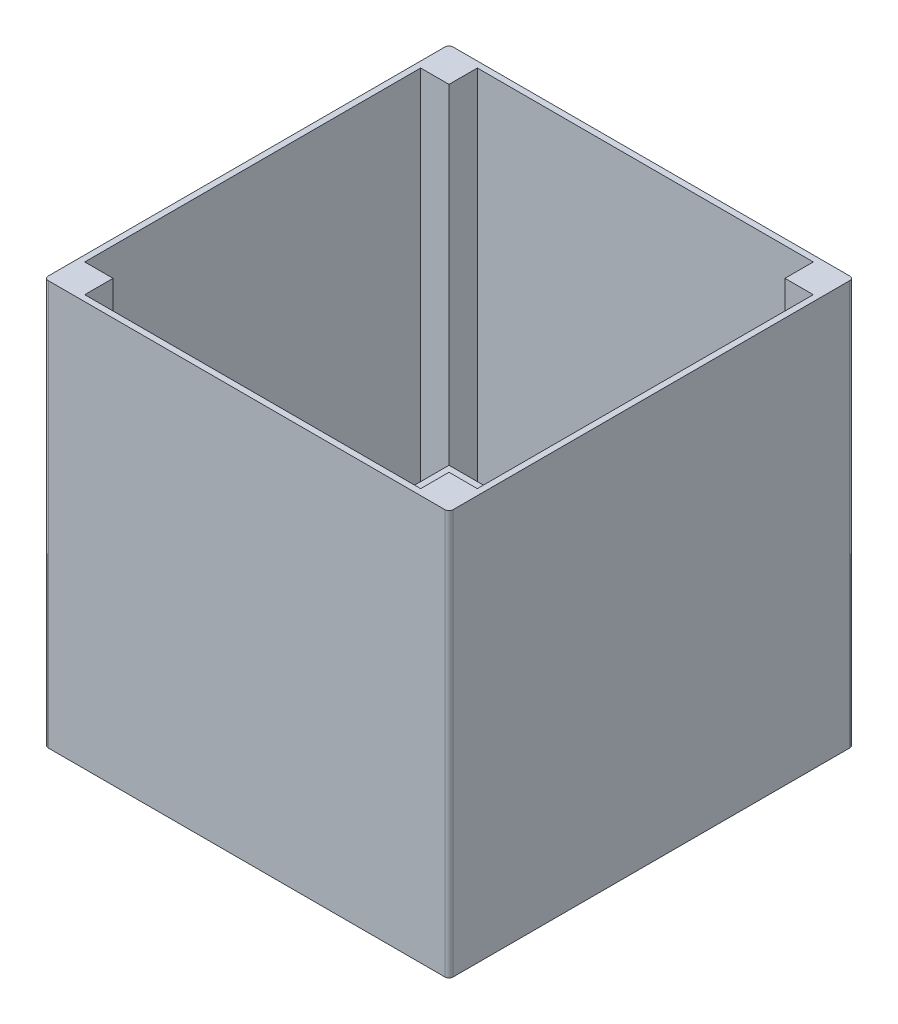
ISO-10303-21;
HEADER;
FILE_DESCRIPTION(('STEP AP214'),'2;1');
FILE_NAME('part.step','',(''),(''),'','','');
FILE_SCHEMA(('AUTOMOTIVE_DESIGN { 1 0 10303 214 1 1 1 1 }'));
ENDSEC;
DATA;
#1=APPLICATION_CONTEXT('core data for automotive mechanical design processes');
#2=APPLICATION_PROTOCOL_DEFINITION('international standard','automotive_design',2000,#1);
#3=PRODUCT_CONTEXT('',#1,'mechanical');
#4=PRODUCT('Part','Part','',(#3));
#5=PRODUCT_RELATED_PRODUCT_CATEGORY('part','',(#4));
#6=PRODUCT_DEFINITION_FORMATION('','',#4);
#7=PRODUCT_DEFINITION_CONTEXT('part definition',#1,'design');
#8=PRODUCT_DEFINITION('design','',#6,#7);
#9=PRODUCT_DEFINITION_SHAPE('','',#8);
#10=(LENGTH_UNIT() NAMED_UNIT(*) SI_UNIT(.MILLI.,.METRE.));
#11=(NAMED_UNIT(*) PLANE_ANGLE_UNIT() SI_UNIT($,.RADIAN.));
#12=(NAMED_UNIT(*) SI_UNIT($,.STERADIAN.) SOLID_ANGLE_UNIT());
#13=UNCERTAINTY_MEASURE_WITH_UNIT(LENGTH_MEASURE(1.E-05),#10,'distance_accuracy_value','');
#14=(GEOMETRIC_REPRESENTATION_CONTEXT(3) GLOBAL_UNCERTAINTY_ASSIGNED_CONTEXT((#13)) GLOBAL_UNIT_ASSIGNED_CONTEXT((#10,
#11,#12)) REPRESENTATION_CONTEXT('',''));
#15=CARTESIAN_POINT('',(0.,0.,0.));
#16=DIRECTION('',(0.,0.,1.));
#17=DIRECTION('',(1.,0.,0.));
#18=AXIS2_PLACEMENT_3D('',#15,#16,#17);
#19=CARTESIAN_POINT('',(0.,18.,0.));
#20=DIRECTION('',(0.,1.,0.));
#21=DIRECTION('',(0.,0.,1.));
#22=AXIS2_PLACEMENT_3D('',#19,#20,#21);
#23=PLANE('',#22);
#24=DIRECTION('',(0.,0.,-1.));
#25=VECTOR('',#24,1.);
#26=CARTESIAN_POINT('',(-40.,18.,40.));
#27=LINE('',#26,#25);
#28=CARTESIAN_POINT('',(-40.,18.,40.));
#29=VERTEX_POINT('',#28);
#30=CARTESIAN_POINT('',(-40.,18.,-40.));
#31=VERTEX_POINT('',#30);
#32=EDGE_CURVE('E114',#29,#31,#27,.T.);
#33=ORIENTED_EDGE('',*,*,#32,.T.);
#34=DIRECTION('',(1.,0.,0.));
#35=VECTOR('',#34,1.);
#36=CARTESIAN_POINT('',(40.,18.,-40.));
#37=LINE('',#36,#35);
#38=CARTESIAN_POINT('',(40.,18.,-40.));
#39=VERTEX_POINT('',#38);
#40=EDGE_CURVE('E109',#31,#39,#37,.T.);
#41=ORIENTED_EDGE('',*,*,#40,.T.);
#42=DIRECTION('',(0.,0.,1.));
#43=VECTOR('',#42,1.);
#44=CARTESIAN_POINT('',(40.,18.,40.));
#45=LINE('',#44,#43);
#46=CARTESIAN_POINT('',(40.,18.,40.));
#47=VERTEX_POINT('',#46);
#48=EDGE_CURVE('E112',#39,#47,#45,.T.);
#49=ORIENTED_EDGE('',*,*,#48,.T.);
#50=DIRECTION('',(-1.,0.,0.));
#51=VECTOR('',#50,1.);
#52=CARTESIAN_POINT('',(40.,18.,40.));
#53=LINE('',#52,#51);
#54=EDGE_CURVE('E79',#47,#29,#53,.T.);
#55=ORIENTED_EDGE('',*,*,#54,.T.);
#56=EDGE_LOOP('',(#33,#41,#49,#55));
#57=FACE_BOUND('',#56,.T.);
#58=CARTESIAN_POINT('',(35.,18.,35.));
#59=DIRECTION('',(0.,-1.,0.));
#60=DIRECTION('',(0.,0.,-1.));
#61=AXIS2_PLACEMENT_3D('',#58,#59,#60);
#62=CIRCLE('',#61,1.6);
#63=CARTESIAN_POINT('',(35.,18.,33.4));
#64=VERTEX_POINT('',#63);
#65=EDGE_CURVE('E135',#64,#64,#62,.T.);
#66=ORIENTED_EDGE('',*,*,#65,.F.);
#67=EDGE_LOOP('',(#66));
#68=FACE_BOUND('',#67,.T.);
#69=CARTESIAN_POINT('',(-35.,18.,-35.));
#70=DIRECTION('',(0.,-1.,0.));
#71=DIRECTION('',(0.,0.,1.));
#72=AXIS2_PLACEMENT_3D('',#69,#70,#71);
#73=CIRCLE('',#72,1.6);
#74=CARTESIAN_POINT('',(-35.,18.,-33.4));
#75=VERTEX_POINT('',#74);
#76=EDGE_CURVE('E159',#75,#75,#73,.T.);
#77=ORIENTED_EDGE('',*,*,#76,.F.);
#78=EDGE_LOOP('',(#77));
#79=FACE_BOUND('',#78,.T.);
#80=CARTESIAN_POINT('',(-35.,18.,35.));
#81=DIRECTION('',(0.,-1.,0.));
#82=DIRECTION('',(0.,0.,1.));
#83=AXIS2_PLACEMENT_3D('',#80,#81,#82);
#84=CIRCLE('',#83,1.6);
#85=CARTESIAN_POINT('',(-35.,18.,36.6));
#86=VERTEX_POINT('',#85);
#87=EDGE_CURVE('E167',#86,#86,#84,.T.);
#88=ORIENTED_EDGE('',*,*,#87,.F.);
#89=EDGE_LOOP('',(#88));
#90=FACE_BOUND('',#89,.T.);
#91=CARTESIAN_POINT('',(35.,18.,-35.));
#92=DIRECTION('',(0.,-1.,0.));
#93=DIRECTION('',(0.,0.,-1.));
#94=AXIS2_PLACEMENT_3D('',#91,#92,#93);
#95=CIRCLE('',#94,1.6);
#96=CARTESIAN_POINT('',(35.,18.,-36.6));
#97=VERTEX_POINT('',#96);
#98=EDGE_CURVE('E175',#97,#97,#95,.T.);
#99=ORIENTED_EDGE('',*,*,#98,.F.);
#100=EDGE_LOOP('',(#99));
#101=FACE_BOUND('',#100,.T.);
#102=ADVANCED_FACE('F61',(#57,#68,#79,#90,#101),#23,.F.);
#103=CARTESIAN_POINT('',(0.,20.,0.));
#104=DIRECTION('',(0.,1.,0.));
#105=DIRECTION('',(0.,0.,1.));
#106=AXIS2_PLACEMENT_3D('',#103,#104,#105);
#107=PLANE('',#106);
#108=CARTESIAN_POINT('',(-35.,20.,35.));
#109=DIRECTION('',(0.,-1.,0.));
#110=DIRECTION('',(0.,0.,1.));
#111=AXIS2_PLACEMENT_3D('',#108,#109,#110);
#112=CIRCLE('',#111,1.6);
#113=CARTESIAN_POINT('',(-35.,20.,36.6));
#114=VERTEX_POINT('',#113);
#115=EDGE_CURVE('E171',#114,#114,#112,.T.);
#116=ORIENTED_EDGE('',*,*,#115,.T.);
#117=EDGE_LOOP('',(#116));
#118=FACE_BOUND('',#117,.T.);
#119=CARTESIAN_POINT('',(35.,20.,35.));
#120=DIRECTION('',(0.,-1.,0.));
#121=DIRECTION('',(0.,0.,-1.));
#122=AXIS2_PLACEMENT_3D('',#119,#120,#121);
#123=CIRCLE('',#122,1.6);
#124=CARTESIAN_POINT('',(35.,20.,33.4));
#125=VERTEX_POINT('',#124);
#126=EDGE_CURVE('E155',#125,#125,#123,.T.);
#127=ORIENTED_EDGE('',*,*,#126,.T.);
#128=EDGE_LOOP('',(#127));
#129=FACE_BOUND('',#128,.T.);
#130=DIRECTION('',(0.,0.,-1.));
#131=VECTOR('',#130,1.);
#132=CARTESIAN_POINT('',(-40.,20.,40.));
#133=LINE('',#132,#131);
#134=CARTESIAN_POINT('',(-40.,20.,40.));
#135=VERTEX_POINT('',#134);
#136=CARTESIAN_POINT('',(-40.,20.,-40.));
#137=VERTEX_POINT('',#136);
#138=EDGE_CURVE('E131',#135,#137,#133,.T.);
#139=ORIENTED_EDGE('',*,*,#138,.F.);
#140=DIRECTION('',(-1.,0.,0.));
#141=VECTOR('',#140,1.);
#142=CARTESIAN_POINT('',(40.,20.,40.));
#143=LINE('',#142,#141);
#144=CARTESIAN_POINT('',(40.,20.,40.));
#145=VERTEX_POINT('',#144);
#146=EDGE_CURVE('E102',#145,#135,#143,.T.);
#147=ORIENTED_EDGE('',*,*,#146,.F.);
#148=DIRECTION('',(0.,0.,1.));
#149=VECTOR('',#148,1.);
#150=CARTESIAN_POINT('',(40.,20.,40.));
#151=LINE('',#150,#149);
#152=CARTESIAN_POINT('',(40.,20.,-40.));
#153=VERTEX_POINT('',#152);
#154=EDGE_CURVE('E96',#153,#145,#151,.T.);
#155=ORIENTED_EDGE('',*,*,#154,.F.);
#156=DIRECTION('',(1.,0.,0.));
#157=VECTOR('',#156,1.);
#158=CARTESIAN_POINT('',(40.,20.,-40.));
#159=LINE('',#158,#157);
#160=EDGE_CURVE('E119',#137,#153,#159,.T.);
#161=ORIENTED_EDGE('',*,*,#160,.F.);
#162=EDGE_LOOP('',(#139,#147,#155,#161));
#163=FACE_BOUND('',#162,.T.);
#164=CARTESIAN_POINT('',(-35.,20.,-35.));
#165=DIRECTION('',(0.,-1.,0.));
#166=DIRECTION('',(0.,0.,1.));
#167=AXIS2_PLACEMENT_3D('',#164,#165,#166);
#168=CIRCLE('',#167,1.6);
#169=CARTESIAN_POINT('',(-35.,20.,-33.4));
#170=VERTEX_POINT('',#169);
#171=EDGE_CURVE('E163',#170,#170,#168,.T.);
#172=ORIENTED_EDGE('',*,*,#171,.T.);
#173=EDGE_LOOP('',(#172));
#174=FACE_BOUND('',#173,.T.);
#175=CARTESIAN_POINT('',(35.,20.,-35.));
#176=DIRECTION('',(0.,-1.,0.));
#177=DIRECTION('',(0.,0.,-1.));
#178=AXIS2_PLACEMENT_3D('',#175,#176,#177);
#179=CIRCLE('',#178,1.6);
#180=CARTESIAN_POINT('',(35.,20.,-36.6));
#181=VERTEX_POINT('',#180);
#182=EDGE_CURVE('E179',#181,#181,#179,.T.);
#183=ORIENTED_EDGE('',*,*,#182,.T.);
#184=EDGE_LOOP('',(#183));
#185=FACE_BOUND('',#184,.T.);
#186=ADVANCED_FACE('F149',(#118,#129,#163,#174,#185),#107,.T.);
#187=CARTESIAN_POINT('',(-40.,18.,40.));
#188=DIRECTION('',(1.,0.,0.));
#189=DIRECTION('',(0.,0.,-1.));
#190=AXIS2_PLACEMENT_3D('',#187,#188,#189);
#191=PLANE('',#190);
#192=ORIENTED_EDGE('',*,*,#138,.T.);
#193=DIRECTION('',(0.,1.,0.));
#194=VECTOR('',#193,1.);
#195=CARTESIAN_POINT('',(-40.,18.,-40.));
#196=LINE('',#195,#194);
#197=EDGE_CURVE('E12',#31,#137,#196,.T.);
#198=ORIENTED_EDGE('',*,*,#197,.F.);
#199=ORIENTED_EDGE('',*,*,#32,.F.);
#200=DIRECTION('',(0.,1.,0.));
#201=VECTOR('',#200,1.);
#202=CARTESIAN_POINT('',(-40.,18.,40.));
#203=LINE('',#202,#201);
#204=EDGE_CURVE('E127',#29,#135,#203,.T.);
#205=ORIENTED_EDGE('',*,*,#204,.T.);
#206=EDGE_LOOP('',(#192,#198,#199,#205));
#207=FACE_BOUND('',#206,.T.);
#208=ADVANCED_FACE('F63',(#207),#191,.F.);
#209=CARTESIAN_POINT('',(40.,18.,-40.));
#210=DIRECTION('',(0.,0.,1.));
#211=DIRECTION('',(1.,0.,0.));
#212=AXIS2_PLACEMENT_3D('',#209,#210,#211);
#213=PLANE('',#212);
#214=ORIENTED_EDGE('',*,*,#160,.T.);
#215=DIRECTION('',(0.,1.,0.));
#216=VECTOR('',#215,1.);
#217=CARTESIAN_POINT('',(40.,18.,-40.));
#218=LINE('',#217,#216);
#219=EDGE_CURVE('E71',#39,#153,#218,.T.);
#220=ORIENTED_EDGE('',*,*,#219,.F.);
#221=ORIENTED_EDGE('',*,*,#40,.F.);
#222=ORIENTED_EDGE('',*,*,#197,.T.);
#223=EDGE_LOOP('',(#214,#220,#221,#222));
#224=FACE_BOUND('',#223,.T.);
#225=ADVANCED_FACE('F118',(#224),#213,.F.);
#226=CARTESIAN_POINT('',(40.,18.,40.));
#227=DIRECTION('',(-1.,0.,0.));
#228=DIRECTION('',(0.,0.,1.));
#229=AXIS2_PLACEMENT_3D('',#226,#227,#228);
#230=PLANE('',#229);
#231=ORIENTED_EDGE('',*,*,#154,.T.);
#232=DIRECTION('',(0.,1.,0.));
#233=VECTOR('',#232,1.);
#234=CARTESIAN_POINT('',(40.,18.,40.));
#235=LINE('',#234,#233);
#236=EDGE_CURVE('E121',#47,#145,#235,.T.);
#237=ORIENTED_EDGE('',*,*,#236,.F.);
#238=ORIENTED_EDGE('',*,*,#48,.F.);
#239=ORIENTED_EDGE('',*,*,#219,.T.);
#240=EDGE_LOOP('',(#231,#237,#238,#239));
#241=FACE_BOUND('',#240,.T.);
#242=ADVANCED_FACE('F122',(#241),#230,.F.);
#243=CARTESIAN_POINT('',(40.,18.,40.));
#244=DIRECTION('',(0.,0.,-1.));
#245=DIRECTION('',(-1.,0.,0.));
#246=AXIS2_PLACEMENT_3D('',#243,#244,#245);
#247=PLANE('',#246);
#248=ORIENTED_EDGE('',*,*,#146,.T.);
#249=ORIENTED_EDGE('',*,*,#204,.F.);
#250=ORIENTED_EDGE('',*,*,#54,.F.);
#251=ORIENTED_EDGE('',*,*,#236,.T.);
#252=EDGE_LOOP('',(#248,#249,#250,#251));
#253=FACE_BOUND('',#252,.T.);
#254=ADVANCED_FACE('F146',(#253),#247,.F.);
#255=CARTESIAN_POINT('',(35.,18.,35.));
#256=DIRECTION('',(0.,1.,0.));
#257=DIRECTION('',(0.,0.,1.));
#258=AXIS2_PLACEMENT_3D('',#255,#256,#257);
#259=CYLINDRICAL_SURFACE('',#258,1.6);
#260=ORIENTED_EDGE('',*,*,#65,.T.);
#261=EDGE_LOOP('',(#260));
#262=FACE_BOUND('',#261,.T.);
#263=ORIENTED_EDGE('',*,*,#126,.F.);
#264=EDGE_LOOP('',(#263));
#265=FACE_BOUND('',#264,.T.);
#266=ADVANCED_FACE('F199',(#262,#265),#259,.F.);
#267=CARTESIAN_POINT('',(-35.,18.,-35.));
#268=DIRECTION('',(0.,1.,0.));
#269=DIRECTION('',(0.,0.,1.));
#270=AXIS2_PLACEMENT_3D('',#267,#268,#269);
#271=CYLINDRICAL_SURFACE('',#270,1.6);
#272=ORIENTED_EDGE('',*,*,#76,.T.);
#273=EDGE_LOOP('',(#272));
#274=FACE_BOUND('',#273,.T.);
#275=ORIENTED_EDGE('',*,*,#171,.F.);
#276=EDGE_LOOP('',(#275));
#277=FACE_BOUND('',#276,.T.);
#278=ADVANCED_FACE('F250',(#274,#277),#271,.F.);
#279=CARTESIAN_POINT('',(-35.,18.,35.));
#280=DIRECTION('',(0.,1.,0.));
#281=DIRECTION('',(0.,0.,1.));
#282=AXIS2_PLACEMENT_3D('',#279,#280,#281);
#283=CYLINDRICAL_SURFACE('',#282,1.6);
#284=ORIENTED_EDGE('',*,*,#87,.T.);
#285=EDGE_LOOP('',(#284));
#286=FACE_BOUND('',#285,.T.);
#287=ORIENTED_EDGE('',*,*,#115,.F.);
#288=EDGE_LOOP('',(#287));
#289=FACE_BOUND('',#288,.T.);
#290=ADVANCED_FACE('F258',(#286,#289),#283,.F.);
#291=CARTESIAN_POINT('',(35.,18.,-35.));
#292=DIRECTION('',(0.,1.,0.));
#293=DIRECTION('',(0.,0.,1.));
#294=AXIS2_PLACEMENT_3D('',#291,#292,#293);
#295=CYLINDRICAL_SURFACE('',#294,1.6);
#296=ORIENTED_EDGE('',*,*,#98,.T.);
#297=EDGE_LOOP('',(#296));
#298=FACE_BOUND('',#297,.T.);
#299=ORIENTED_EDGE('',*,*,#182,.F.);
#300=EDGE_LOOP('',(#299));
#301=FACE_BOUND('',#300,.T.);
#302=ADVANCED_FACE('F188',(#298,#301),#295,.F.);
#303=CLOSED_SHELL('',(#102,#186,#208,#225,#242,#254,#266,#278,#290,#302));
#304=MANIFOLD_SOLID_BREP('B2',#303);
#305=CARTESIAN_POINT('',(0.,100.,-50.));
#306=DIRECTION('',(0.,0.,-1.));
#307=DIRECTION('',(-1.,0.,0.));
#308=AXIS2_PLACEMENT_3D('',#305,#306,#307);
#309=PLANE('',#308);
#310=DIRECTION('',(1.,0.,0.));
#311=VECTOR('',#310,1.);
#312=CARTESIAN_POINT('',(0.,0.,-50.));
#313=LINE('',#312,#311);
#314=CARTESIAN_POINT('',(-49.,0.,-50.));
#315=VERTEX_POINT('',#314);
#316=CARTESIAN_POINT('',(49.,0.,-50.));
#317=VERTEX_POINT('',#316);
#318=EDGE_CURVE('E574',#315,#317,#313,.T.);
#319=ORIENTED_EDGE('',*,*,#318,.F.);
#320=DIRECTION('',(0.,-1.,0.));
#321=VECTOR('',#320,1.);
#322=CARTESIAN_POINT('',(-49.,100.,-50.));
#323=LINE('',#322,#321);
#324=CARTESIAN_POINT('',(-49.,100.,-50.));
#325=VERTEX_POINT('',#324);
#326=EDGE_CURVE('E59',#315,#325,#323,.F.);
#327=ORIENTED_EDGE('',*,*,#326,.T.);
#328=DIRECTION('',(1.,0.,0.));
#329=VECTOR('',#328,1.);
#330=CARTESIAN_POINT('',(0.,100.,-50.));
#331=LINE('',#330,#329);
#332=CARTESIAN_POINT('',(49.,100.,-50.));
#333=VERTEX_POINT('',#332);
#334=EDGE_CURVE('E516',#325,#333,#331,.T.);
#335=ORIENTED_EDGE('',*,*,#334,.T.);
#336=DIRECTION('',(0.,-1.,0.));
#337=VECTOR('',#336,1.);
#338=CARTESIAN_POINT('',(49.,0.,-50.));
#339=LINE('',#338,#337);
#340=EDGE_CURVE('E322',#333,#317,#339,.T.);
#341=ORIENTED_EDGE('',*,*,#340,.T.);
#342=EDGE_LOOP('',(#319,#327,#335,#341));
#343=FACE_BOUND('',#342,.T.);
#344=ADVANCED_FACE('F313',(#343),#309,.T.);
#345=CARTESIAN_POINT('',(-50.,100.,0.));
#346=DIRECTION('',(-1.,0.,0.));
#347=DIRECTION('',(0.,0.,1.));
#348=AXIS2_PLACEMENT_3D('',#345,#346,#347);
#349=PLANE('',#348);
#350=DIRECTION('',(0.,0.,-1.));
#351=VECTOR('',#350,1.);
#352=CARTESIAN_POINT('',(-50.,0.,0.));
#353=LINE('',#352,#351);
#354=CARTESIAN_POINT('',(-50.,0.,49.));
#355=VERTEX_POINT('',#354);
#356=CARTESIAN_POINT('',(-50.,0.,-49.));
#357=VERTEX_POINT('',#356);
#358=EDGE_CURVE('E578',#355,#357,#353,.T.);
#359=ORIENTED_EDGE('',*,*,#358,.F.);
#360=DIRECTION('',(0.,-1.,0.));
#361=VECTOR('',#360,1.);
#362=CARTESIAN_POINT('',(-50.,100.,49.));
#363=LINE('',#362,#361);
#364=CARTESIAN_POINT('',(-50.,100.,49.));
#365=VERTEX_POINT('',#364);
#366=EDGE_CURVE('E336',#355,#365,#363,.F.);
#367=ORIENTED_EDGE('',*,*,#366,.T.);
#368=DIRECTION('',(0.,0.,-1.));
#369=VECTOR('',#368,1.);
#370=CARTESIAN_POINT('',(-50.,100.,0.));
#371=LINE('',#370,#369);
#372=CARTESIAN_POINT('',(-50.,100.,-49.));
#373=VERTEX_POINT('',#372);
#374=EDGE_CURVE('E520',#365,#373,#371,.T.);
#375=ORIENTED_EDGE('',*,*,#374,.T.);
#376=DIRECTION('',(0.,-1.,0.));
#377=VECTOR('',#376,1.);
#378=CARTESIAN_POINT('',(-50.,100.,-49.));
#379=LINE('',#378,#377);
#380=EDGE_CURVE('E659',#373,#357,#379,.T.);
#381=ORIENTED_EDGE('',*,*,#380,.T.);
#382=EDGE_LOOP('',(#359,#367,#375,#381));
#383=FACE_BOUND('',#382,.T.);
#384=ADVANCED_FACE('F679',(#383),#349,.T.);
#385=CARTESIAN_POINT('',(0.,100.,50.));
#386=DIRECTION('',(0.,0.,-1.));
#387=DIRECTION('',(-1.,0.,0.));
#388=AXIS2_PLACEMENT_3D('',#385,#386,#387);
#389=PLANE('',#388);
#390=DIRECTION('',(1.,0.,0.));
#391=VECTOR('',#390,1.);
#392=CARTESIAN_POINT('',(0.,0.,50.));
#393=LINE('',#392,#391);
#394=CARTESIAN_POINT('',(-49.,0.,50.));
#395=VERTEX_POINT('',#394);
#396=CARTESIAN_POINT('',(49.,0.,50.));
#397=VERTEX_POINT('',#396);
#398=EDGE_CURVE('E582',#395,#397,#393,.T.);
#399=ORIENTED_EDGE('',*,*,#398,.T.);
#400=DIRECTION('',(0.,-1.,0.));
#401=VECTOR('',#400,1.);
#402=CARTESIAN_POINT('',(49.,100.,50.));
#403=LINE('',#402,#401);
#404=CARTESIAN_POINT('',(49.,100.,50.));
#405=VERTEX_POINT('',#404);
#406=EDGE_CURVE('E645',#397,#405,#403,.F.);
#407=ORIENTED_EDGE('',*,*,#406,.T.);
#408=DIRECTION('',(1.,0.,0.));
#409=VECTOR('',#408,1.);
#410=CARTESIAN_POINT('',(0.,100.,50.));
#411=LINE('',#410,#409);
#412=CARTESIAN_POINT('',(-49.,100.,50.));
#413=VERTEX_POINT('',#412);
#414=EDGE_CURVE('E523',#413,#405,#411,.T.);
#415=ORIENTED_EDGE('',*,*,#414,.F.);
#416=DIRECTION('',(0.,-1.,0.));
#417=VECTOR('',#416,1.);
#418=CARTESIAN_POINT('',(-49.,0.,50.));
#419=LINE('',#418,#417);
#420=EDGE_CURVE('E641',#413,#395,#419,.T.);
#421=ORIENTED_EDGE('',*,*,#420,.T.);
#422=EDGE_LOOP('',(#399,#407,#415,#421));
#423=FACE_BOUND('',#422,.T.);
#424=ADVANCED_FACE('F687',(#423),#389,.F.);
#425=CARTESIAN_POINT('',(0.,100.,41.4999999999999));
#426=DIRECTION('',(0.,0.,-1.));
#427=DIRECTION('',(-1.,0.,0.));
#428=AXIS2_PLACEMENT_3D('',#425,#426,#427);
#429=PLANE('',#428);
#430=DIRECTION('',(1.,0.,0.));
#431=VECTOR('',#430,1.);
#432=CARTESIAN_POINT('',(0.,0.,41.4999999999999));
#433=LINE('',#432,#431);
#434=CARTESIAN_POINT('',(-48.5,0.,41.5));
#435=VERTEX_POINT('',#434);
#436=CARTESIAN_POINT('',(-41.5000000000002,0.,41.5));
#437=VERTEX_POINT('',#436);
#438=EDGE_CURVE('E458',#435,#437,#433,.T.);
#439=ORIENTED_EDGE('',*,*,#438,.F.);
#440=DIRECTION('',(0.,-1.,0.));
#441=VECTOR('',#440,1.);
#442=CARTESIAN_POINT('',(-48.5,100.,41.5));
#443=LINE('',#442,#441);
#444=CARTESIAN_POINT('',(-48.5,100.,41.5));
#445=VERTEX_POINT('',#444);
#446=EDGE_CURVE('E452',#445,#435,#443,.T.);
#447=ORIENTED_EDGE('',*,*,#446,.F.);
#448=DIRECTION('',(1.,0.,0.));
#449=VECTOR('',#448,1.);
#450=CARTESIAN_POINT('',(0.,100.,41.4999999999999));
#451=LINE('',#450,#449);
#452=CARTESIAN_POINT('',(-41.5000000000002,100.,41.5));
#453=VERTEX_POINT('',#452);
#454=EDGE_CURVE('E455',#445,#453,#451,.T.);
#455=ORIENTED_EDGE('',*,*,#454,.T.);
#456=DIRECTION('',(0.,-1.,0.));
#457=VECTOR('',#456,1.);
#458=CARTESIAN_POINT('',(-41.5000000000002,100.,41.5));
#459=LINE('',#458,#457);
#460=EDGE_CURVE('E531',#453,#437,#459,.T.);
#461=ORIENTED_EDGE('',*,*,#460,.T.);
#462=EDGE_LOOP('',(#439,#447,#455,#461));
#463=FACE_BOUND('',#462,.T.);
#464=ADVANCED_FACE('F454',(#463),#429,.T.);
#465=CARTESIAN_POINT('',(-48.5,100.,0.));
#466=DIRECTION('',(1.,0.,0.));
#467=DIRECTION('',(0.,0.,-1.));
#468=AXIS2_PLACEMENT_3D('',#465,#466,#467);
#469=PLANE('',#468);
#470=DIRECTION('',(0.,0.,1.));
#471=VECTOR('',#470,1.);
#472=CARTESIAN_POINT('',(-48.5,0.,0.));
#473=LINE('',#472,#471);
#474=CARTESIAN_POINT('',(-48.5,0.,-41.5000000000002));
#475=VERTEX_POINT('',#474);
#476=EDGE_CURVE('E534',#475,#435,#473,.T.);
#477=ORIENTED_EDGE('',*,*,#476,.F.);
#478=DIRECTION('',(0.,-1.,0.));
#479=VECTOR('',#478,1.);
#480=CARTESIAN_POINT('',(-48.5,100.,-41.5000000000002));
#481=LINE('',#480,#479);
#482=CARTESIAN_POINT('',(-48.5,100.,-41.5000000000002));
#483=VERTEX_POINT('',#482);
#484=EDGE_CURVE('E465',#483,#475,#481,.T.);
#485=ORIENTED_EDGE('',*,*,#484,.F.);
#486=DIRECTION('',(0.,0.,1.));
#487=VECTOR('',#486,1.);
#488=CARTESIAN_POINT('',(-48.5,100.,0.));
#489=LINE('',#488,#487);
#490=EDGE_CURVE('E471',#483,#445,#489,.T.);
#491=ORIENTED_EDGE('',*,*,#490,.T.);
#492=ORIENTED_EDGE('',*,*,#446,.T.);
#493=EDGE_LOOP('',(#477,#485,#491,#492));
#494=FACE_BOUND('',#493,.T.);
#495=ADVANCED_FACE('F479',(#494),#469,.T.);
#496=CARTESIAN_POINT('',(0.,100.,-41.5000000000002));
#497=DIRECTION('',(0.,0.,1.));
#498=DIRECTION('',(1.,0.,0.));
#499=AXIS2_PLACEMENT_3D('',#496,#497,#498);
#500=PLANE('',#499);
#501=DIRECTION('',(-1.,0.,0.));
#502=VECTOR('',#501,1.);
#503=CARTESIAN_POINT('',(0.,0.,-41.5000000000002));
#504=LINE('',#503,#502);
#505=CARTESIAN_POINT('',(-41.5,0.,-41.5000000000002));
#506=VERTEX_POINT('',#505);
#507=EDGE_CURVE('E537',#506,#475,#504,.T.);
#508=ORIENTED_EDGE('',*,*,#507,.F.);
#509=DIRECTION('',(0.,-1.,0.));
#510=VECTOR('',#509,1.);
#511=CARTESIAN_POINT('',(-41.5,100.,-41.5000000000002));
#512=LINE('',#511,#510);
#513=CARTESIAN_POINT('',(-41.5,100.,-41.5000000000002));
#514=VERTEX_POINT('',#513);
#515=EDGE_CURVE('E618',#514,#506,#512,.T.);
#516=ORIENTED_EDGE('',*,*,#515,.F.);
#517=DIRECTION('',(-1.,0.,0.));
#518=VECTOR('',#517,1.);
#519=CARTESIAN_POINT('',(0.,100.,-41.5000000000002));
#520=LINE('',#519,#518);
#521=EDGE_CURVE('E481',#514,#483,#520,.T.);
#522=ORIENTED_EDGE('',*,*,#521,.T.);
#523=ORIENTED_EDGE('',*,*,#484,.T.);
#524=EDGE_LOOP('',(#508,#516,#522,#523));
#525=FACE_BOUND('',#524,.T.);
#526=ADVANCED_FACE('F744',(#525),#500,.T.);
#527=CARTESIAN_POINT('',(-41.5,100.,0.));
#528=DIRECTION('',(1.,0.,0.));
#529=DIRECTION('',(0.,0.,-1.));
#530=AXIS2_PLACEMENT_3D('',#527,#528,#529);
#531=PLANE('',#530);
#532=DIRECTION('',(0.,0.,1.));
#533=VECTOR('',#532,1.);
#534=CARTESIAN_POINT('',(-41.5,0.,0.));
#535=LINE('',#534,#533);
#536=CARTESIAN_POINT('',(-41.5,0.,-48.5));
#537=VERTEX_POINT('',#536);
#538=EDGE_CURVE('E541',#537,#506,#535,.T.);
#539=ORIENTED_EDGE('',*,*,#538,.F.);
#540=DIRECTION('',(0.,-1.,0.));
#541=VECTOR('',#540,1.);
#542=CARTESIAN_POINT('',(-41.5,100.,-48.5));
#543=LINE('',#542,#541);
#544=CARTESIAN_POINT('',(-41.5,100.,-48.5));
#545=VERTEX_POINT('',#544);
#546=EDGE_CURVE('E615',#545,#537,#543,.T.);
#547=ORIENTED_EDGE('',*,*,#546,.F.);
#548=DIRECTION('',(0.,0.,1.));
#549=VECTOR('',#548,1.);
#550=CARTESIAN_POINT('',(-41.5,100.,0.));
#551=LINE('',#550,#549);
#552=EDGE_CURVE('E485',#545,#514,#551,.T.);
#553=ORIENTED_EDGE('',*,*,#552,.T.);
#554=ORIENTED_EDGE('',*,*,#515,.T.);
#555=EDGE_LOOP('',(#539,#547,#553,#554));
#556=FACE_BOUND('',#555,.T.);
#557=ADVANCED_FACE('F740',(#556),#531,.T.);
#558=CARTESIAN_POINT('',(0.,100.,-48.5));
#559=DIRECTION('',(0.,0.,-1.));
#560=DIRECTION('',(-1.,0.,0.));
#561=AXIS2_PLACEMENT_3D('',#558,#559,#560);
#562=PLANE('',#561);
#563=DIRECTION('',(1.,0.,0.));
#564=VECTOR('',#563,1.);
#565=CARTESIAN_POINT('',(0.,0.,-48.5));
#566=LINE('',#565,#564);
#567=CARTESIAN_POINT('',(41.5,0.,-48.5));
#568=VERTEX_POINT('',#567);
#569=EDGE_CURVE('E545',#537,#568,#566,.T.);
#570=ORIENTED_EDGE('',*,*,#569,.T.);
#571=DIRECTION('',(0.,-1.,0.));
#572=VECTOR('',#571,1.);
#573=CARTESIAN_POINT('',(41.5,100.,-48.5));
#574=LINE('',#573,#572);
#575=CARTESIAN_POINT('',(41.5,100.,-48.5));
#576=VERTEX_POINT('',#575);
#577=EDGE_CURVE('E611',#576,#568,#574,.T.);
#578=ORIENTED_EDGE('',*,*,#577,.F.);
#579=DIRECTION('',(1.,0.,0.));
#580=VECTOR('',#579,1.);
#581=CARTESIAN_POINT('',(0.,100.,-48.5));
#582=LINE('',#581,#580);
#583=EDGE_CURVE('E491',#545,#576,#582,.T.);
#584=ORIENTED_EDGE('',*,*,#583,.F.);
#585=ORIENTED_EDGE('',*,*,#546,.T.);
#586=EDGE_LOOP('',(#570,#578,#584,#585));
#587=FACE_BOUND('',#586,.T.);
#588=ADVANCED_FACE('F736',(#587),#562,.F.);
#589=CARTESIAN_POINT('',(41.5,100.,0.));
#590=DIRECTION('',(1.,0.,0.));
#591=DIRECTION('',(0.,0.,-1.));
#592=AXIS2_PLACEMENT_3D('',#589,#590,#591);
#593=PLANE('',#592);
#594=DIRECTION('',(0.,0.,1.));
#595=VECTOR('',#594,1.);
#596=CARTESIAN_POINT('',(41.5,0.,0.));
#597=LINE('',#596,#595);
#598=CARTESIAN_POINT('',(41.5,0.,-41.5000000000002));
#599=VERTEX_POINT('',#598);
#600=EDGE_CURVE('E548',#568,#599,#597,.T.);
#601=ORIENTED_EDGE('',*,*,#600,.T.);
#602=DIRECTION('',(0.,-1.,0.));
#603=VECTOR('',#602,1.);
#604=CARTESIAN_POINT('',(41.5,100.,-41.5000000000002));
#605=LINE('',#604,#603);
#606=CARTESIAN_POINT('',(41.5,100.,-41.5000000000002));
#607=VERTEX_POINT('',#606);
#608=EDGE_CURVE('E607',#607,#599,#605,.T.);
#609=ORIENTED_EDGE('',*,*,#608,.F.);
#610=DIRECTION('',(0.,0.,1.));
#611=VECTOR('',#610,1.);
#612=CARTESIAN_POINT('',(41.5,100.,0.));
#613=LINE('',#612,#611);
#614=EDGE_CURVE('E494',#576,#607,#613,.T.);
#615=ORIENTED_EDGE('',*,*,#614,.F.);
#616=ORIENTED_EDGE('',*,*,#577,.T.);
#617=EDGE_LOOP('',(#601,#609,#615,#616));
#618=FACE_BOUND('',#617,.T.);
#619=ADVANCED_FACE('F732',(#618),#593,.F.);
#620=CARTESIAN_POINT('',(0.,100.,-41.5000000000002));
#621=DIRECTION('',(0.,0.,-1.));
#622=DIRECTION('',(-1.,0.,0.));
#623=AXIS2_PLACEMENT_3D('',#620,#621,#622);
#624=PLANE('',#623);
#625=DIRECTION('',(1.,0.,0.));
#626=VECTOR('',#625,1.);
#627=CARTESIAN_POINT('',(0.,0.,-41.5000000000002));
#628=LINE('',#627,#626);
#629=CARTESIAN_POINT('',(48.5,0.,-41.5000000000002));
#630=VERTEX_POINT('',#629);
#631=EDGE_CURVE('E551',#599,#630,#628,.T.);
#632=ORIENTED_EDGE('',*,*,#631,.T.);
#633=DIRECTION('',(0.,-1.,0.));
#634=VECTOR('',#633,1.);
#635=CARTESIAN_POINT('',(48.5,100.,-41.5000000000002));
#636=LINE('',#635,#634);
#637=CARTESIAN_POINT('',(48.5,100.,-41.5000000000002));
#638=VERTEX_POINT('',#637);
#639=EDGE_CURVE('E604',#638,#630,#636,.T.);
#640=ORIENTED_EDGE('',*,*,#639,.F.);
#641=DIRECTION('',(1.,0.,0.));
#642=VECTOR('',#641,1.);
#643=CARTESIAN_POINT('',(0.,100.,-41.5000000000002));
#644=LINE('',#643,#642);
#645=EDGE_CURVE('E497',#607,#638,#644,.T.);
#646=ORIENTED_EDGE('',*,*,#645,.F.);
#647=ORIENTED_EDGE('',*,*,#608,.T.);
#648=EDGE_LOOP('',(#632,#640,#646,#647));
#649=FACE_BOUND('',#648,.T.);
#650=ADVANCED_FACE('F728',(#649),#624,.F.);
#651=CARTESIAN_POINT('',(48.5,100.,0.));
#652=DIRECTION('',(-1.,0.,0.));
#653=DIRECTION('',(0.,0.,1.));
#654=AXIS2_PLACEMENT_3D('',#651,#652,#653);
#655=PLANE('',#654);
#656=DIRECTION('',(0.,0.,-1.));
#657=VECTOR('',#656,1.);
#658=CARTESIAN_POINT('',(48.5,0.,0.));
#659=LINE('',#658,#657);
#660=CARTESIAN_POINT('',(48.5,0.,41.5));
#661=VERTEX_POINT('',#660);
#662=EDGE_CURVE('E555',#661,#630,#659,.T.);
#663=ORIENTED_EDGE('',*,*,#662,.F.);
#664=DIRECTION('',(0.,-1.,0.));
#665=VECTOR('',#664,1.);
#666=CARTESIAN_POINT('',(48.5,100.,41.5));
#667=LINE('',#666,#665);
#668=CARTESIAN_POINT('',(48.5,100.,41.5));
#669=VERTEX_POINT('',#668);
#670=EDGE_CURVE('E601',#669,#661,#667,.T.);
#671=ORIENTED_EDGE('',*,*,#670,.F.);
#672=DIRECTION('',(0.,0.,-1.));
#673=VECTOR('',#672,1.);
#674=CARTESIAN_POINT('',(48.5,100.,0.));
#675=LINE('',#674,#673);
#676=EDGE_CURVE('E500',#669,#638,#675,.T.);
#677=ORIENTED_EDGE('',*,*,#676,.T.);
#678=ORIENTED_EDGE('',*,*,#639,.T.);
#679=EDGE_LOOP('',(#663,#671,#677,#678));
#680=FACE_BOUND('',#679,.T.);
#681=ADVANCED_FACE('F724',(#680),#655,.T.);
#682=CARTESIAN_POINT('',(0.,100.,41.5000000000001));
#683=DIRECTION('',(0.,0.,1.));
#684=DIRECTION('',(1.,0.,0.));
#685=AXIS2_PLACEMENT_3D('',#682,#683,#684);
#686=PLANE('',#685);
#687=DIRECTION('',(-1.,0.,0.));
#688=VECTOR('',#687,1.);
#689=CARTESIAN_POINT('',(0.,0.,41.5000000000001));
#690=LINE('',#689,#688);
#691=CARTESIAN_POINT('',(41.5000000000002,0.,41.5));
#692=VERTEX_POINT('',#691);
#693=EDGE_CURVE('E559',#661,#692,#690,.T.);
#694=ORIENTED_EDGE('',*,*,#693,.T.);
#695=DIRECTION('',(0.,-1.,0.));
#696=VECTOR('',#695,1.);
#697=CARTESIAN_POINT('',(41.5000000000002,100.,41.5));
#698=LINE('',#697,#696);
#699=CARTESIAN_POINT('',(41.5000000000002,100.,41.5));
#700=VERTEX_POINT('',#699);
#701=EDGE_CURVE('E597',#700,#692,#698,.T.);
#702=ORIENTED_EDGE('',*,*,#701,.F.);
#703=DIRECTION('',(-1.,0.,0.));
#704=VECTOR('',#703,1.);
#705=CARTESIAN_POINT('',(0.,100.,41.5000000000001));
#706=LINE('',#705,#704);
#707=EDGE_CURVE('E504',#669,#700,#706,.T.);
#708=ORIENTED_EDGE('',*,*,#707,.F.);
#709=ORIENTED_EDGE('',*,*,#670,.T.);
#710=EDGE_LOOP('',(#694,#702,#708,#709));
#711=FACE_BOUND('',#710,.T.);
#712=ADVANCED_FACE('F720',(#711),#686,.F.);
#713=CARTESIAN_POINT('',(41.5000000000002,100.,0.));
#714=DIRECTION('',(1.,0.,0.));
#715=DIRECTION('',(0.,0.,-1.));
#716=AXIS2_PLACEMENT_3D('',#713,#714,#715);
#717=PLANE('',#716);
#718=DIRECTION('',(0.,0.,1.));
#719=VECTOR('',#718,1.);
#720=CARTESIAN_POINT('',(41.5000000000002,0.,0.));
#721=LINE('',#720,#719);
#722=CARTESIAN_POINT('',(41.5000000000002,0.,48.5));
#723=VERTEX_POINT('',#722);
#724=EDGE_CURVE('E562',#692,#723,#721,.T.);
#725=ORIENTED_EDGE('',*,*,#724,.T.);
#726=DIRECTION('',(0.,-1.,0.));
#727=VECTOR('',#726,1.);
#728=CARTESIAN_POINT('',(41.5000000000002,100.,48.5));
#729=LINE('',#728,#727);
#730=CARTESIAN_POINT('',(41.5000000000002,100.,48.5));
#731=VERTEX_POINT('',#730);
#732=EDGE_CURVE('E594',#731,#723,#729,.T.);
#733=ORIENTED_EDGE('',*,*,#732,.F.);
#734=DIRECTION('',(0.,0.,1.));
#735=VECTOR('',#734,1.);
#736=CARTESIAN_POINT('',(41.5000000000002,100.,0.));
#737=LINE('',#736,#735);
#738=EDGE_CURVE('E507',#700,#731,#737,.T.);
#739=ORIENTED_EDGE('',*,*,#738,.F.);
#740=ORIENTED_EDGE('',*,*,#701,.T.);
#741=EDGE_LOOP('',(#725,#733,#739,#740));
#742=FACE_BOUND('',#741,.T.);
#743=ADVANCED_FACE('F716',(#742),#717,.F.);
#744=CARTESIAN_POINT('',(0.,100.,48.5));
#745=DIRECTION('',(0.,0.,-1.));
#746=DIRECTION('',(-1.,0.,0.));
#747=AXIS2_PLACEMENT_3D('',#744,#745,#746);
#748=PLANE('',#747);
#749=DIRECTION('',(1.,0.,0.));
#750=VECTOR('',#749,1.);
#751=CARTESIAN_POINT('',(0.,0.,48.5));
#752=LINE('',#751,#750);
#753=CARTESIAN_POINT('',(-41.5000000000002,0.,48.5));
#754=VERTEX_POINT('',#753);
#755=EDGE_CURVE('E566',#754,#723,#752,.T.);
#756=ORIENTED_EDGE('',*,*,#755,.F.);
#757=DIRECTION('',(0.,-1.,0.));
#758=VECTOR('',#757,1.);
#759=CARTESIAN_POINT('',(-41.5000000000002,100.,48.5));
#760=LINE('',#759,#758);
#761=CARTESIAN_POINT('',(-41.5000000000002,100.,48.5));
#762=VERTEX_POINT('',#761);
#763=EDGE_CURVE('E591',#762,#754,#760,.T.);
#764=ORIENTED_EDGE('',*,*,#763,.F.);
#765=DIRECTION('',(1.,0.,0.));
#766=VECTOR('',#765,1.);
#767=CARTESIAN_POINT('',(0.,100.,48.5));
#768=LINE('',#767,#766);
#769=EDGE_CURVE('E510',#762,#731,#768,.T.);
#770=ORIENTED_EDGE('',*,*,#769,.T.);
#771=ORIENTED_EDGE('',*,*,#732,.T.);
#772=EDGE_LOOP('',(#756,#764,#770,#771));
#773=FACE_BOUND('',#772,.T.);
#774=ADVANCED_FACE('F712',(#773),#748,.T.);
#775=CARTESIAN_POINT('',(-41.5000000000002,100.,0.));
#776=DIRECTION('',(1.,0.,0.));
#777=DIRECTION('',(0.,0.,-1.));
#778=AXIS2_PLACEMENT_3D('',#775,#776,#777);
#779=PLANE('',#778);
#780=DIRECTION('',(0.,0.,1.));
#781=VECTOR('',#780,1.);
#782=CARTESIAN_POINT('',(-41.5000000000002,0.,0.));
#783=LINE('',#782,#781);
#784=EDGE_CURVE('E570',#437,#754,#783,.T.);
#785=ORIENTED_EDGE('',*,*,#784,.F.);
#786=ORIENTED_EDGE('',*,*,#460,.F.);
#787=DIRECTION('',(0.,0.,1.));
#788=VECTOR('',#787,1.);
#789=CARTESIAN_POINT('',(-41.5000000000002,100.,0.));
#790=LINE('',#789,#788);
#791=EDGE_CURVE('E475',#453,#762,#790,.T.);
#792=ORIENTED_EDGE('',*,*,#791,.T.);
#793=ORIENTED_EDGE('',*,*,#763,.T.);
#794=EDGE_LOOP('',(#785,#786,#792,#793));
#795=FACE_BOUND('',#794,.T.);
#796=ADVANCED_FACE('F710',(#795),#779,.T.);
#797=CARTESIAN_POINT('',(50.,100.,0.));
#798=DIRECTION('',(-1.,0.,0.));
#799=DIRECTION('',(0.,0.,1.));
#800=AXIS2_PLACEMENT_3D('',#797,#798,#799);
#801=PLANE('',#800);
#802=DIRECTION('',(0.,0.,-1.));
#803=VECTOR('',#802,1.);
#804=CARTESIAN_POINT('',(50.,100.,0.));
#805=LINE('',#804,#803);
#806=CARTESIAN_POINT('',(50.,100.,49.));
#807=VERTEX_POINT('',#806);
#808=CARTESIAN_POINT('',(50.,100.,-49.));
#809=VERTEX_POINT('',#808);
#810=EDGE_CURVE('E527',#807,#809,#805,.T.);
#811=ORIENTED_EDGE('',*,*,#810,.F.);
#812=DIRECTION('',(0.,-1.,0.));
#813=VECTOR('',#812,1.);
#814=CARTESIAN_POINT('',(50.,100.,49.));
#815=LINE('',#814,#813);
#816=CARTESIAN_POINT('',(50.,0.,49.));
#817=VERTEX_POINT('',#816);
#818=EDGE_CURVE('E625',#807,#817,#815,.T.);
#819=ORIENTED_EDGE('',*,*,#818,.T.);
#820=DIRECTION('',(0.,0.,-1.));
#821=VECTOR('',#820,1.);
#822=CARTESIAN_POINT('',(50.,0.,0.));
#823=LINE('',#822,#821);
#824=CARTESIAN_POINT('',(50.,0.,-49.));
#825=VERTEX_POINT('',#824);
#826=EDGE_CURVE('E477',#817,#825,#823,.T.);
#827=ORIENTED_EDGE('',*,*,#826,.T.);
#828=DIRECTION('',(0.,-1.,0.));
#829=VECTOR('',#828,1.);
#830=CARTESIAN_POINT('',(50.,100.,-49.));
#831=LINE('',#830,#829);
#832=EDGE_CURVE('E464',#825,#809,#831,.F.);
#833=ORIENTED_EDGE('',*,*,#832,.T.);
#834=EDGE_LOOP('',(#811,#819,#827,#833));
#835=FACE_BOUND('',#834,.T.);
#836=ADVANCED_FACE('F695',(#835),#801,.F.);
#837=CARTESIAN_POINT('',(0.,100.,0.));
#838=DIRECTION('',(0.,1.,0.));
#839=DIRECTION('',(0.,0.,1.));
#840=AXIS2_PLACEMENT_3D('',#837,#838,#839);
#841=PLANE('',#840);
#842=ORIENTED_EDGE('',*,*,#454,.F.);
#843=ORIENTED_EDGE('',*,*,#490,.F.);
#844=ORIENTED_EDGE('',*,*,#521,.F.);
#845=ORIENTED_EDGE('',*,*,#552,.F.);
#846=ORIENTED_EDGE('',*,*,#583,.T.);
#847=ORIENTED_EDGE('',*,*,#614,.T.);
#848=ORIENTED_EDGE('',*,*,#645,.T.);
#849=ORIENTED_EDGE('',*,*,#676,.F.);
#850=ORIENTED_EDGE('',*,*,#707,.T.);
#851=ORIENTED_EDGE('',*,*,#738,.T.);
#852=ORIENTED_EDGE('',*,*,#769,.F.);
#853=ORIENTED_EDGE('',*,*,#791,.F.);
#854=EDGE_LOOP('',(#842,#843,#844,#845,#846,#847,#848,#849,#850,#851,#852,#853));
#855=FACE_BOUND('',#854,.T.);
#856=ORIENTED_EDGE('',*,*,#414,.T.);
#857=CARTESIAN_POINT('',(49.,100.,49.));
#858=DIRECTION('',(0.,1.,0.));
#859=DIRECTION('',(0.,0.,1.));
#860=AXIS2_PLACEMENT_3D('',#857,#858,#859);
#861=CIRCLE('',#860,1.);
#862=EDGE_CURVE('E656',#405,#807,#861,.T.);
#863=ORIENTED_EDGE('',*,*,#862,.T.);
#864=ORIENTED_EDGE('',*,*,#810,.T.);
#865=CARTESIAN_POINT('',(49.,100.,-49.));
#866=DIRECTION('',(0.,1.,0.));
#867=DIRECTION('',(0.,0.,1.));
#868=AXIS2_PLACEMENT_3D('',#865,#866,#867);
#869=CIRCLE('',#868,1.);
#870=EDGE_CURVE('E648',#809,#333,#869,.T.);
#871=ORIENTED_EDGE('',*,*,#870,.T.);
#872=ORIENTED_EDGE('',*,*,#334,.F.);
#873=CARTESIAN_POINT('',(-49.,100.,-49.));
#874=DIRECTION('',(0.,1.,0.));
#875=DIRECTION('',(0.,0.,1.));
#876=AXIS2_PLACEMENT_3D('',#873,#874,#875);
#877=CIRCLE('',#876,1.);
#878=EDGE_CURVE('E329',#325,#373,#877,.T.);
#879=ORIENTED_EDGE('',*,*,#878,.T.);
#880=ORIENTED_EDGE('',*,*,#374,.F.);
#881=CARTESIAN_POINT('',(-49.,100.,49.));
#882=DIRECTION('',(0.,1.,0.));
#883=DIRECTION('',(0.,0.,1.));
#884=AXIS2_PLACEMENT_3D('',#881,#882,#883);
#885=CIRCLE('',#884,1.);
#886=EDGE_CURVE('E653',#365,#413,#885,.T.);
#887=ORIENTED_EDGE('',*,*,#886,.T.);
#888=EDGE_LOOP('',(#856,#863,#864,#871,#872,#879,#880,#887));
#889=FACE_BOUND('',#888,.T.);
#890=ADVANCED_FACE('F469',(#855,#889),#841,.T.);
#891=CARTESIAN_POINT('',(0.,0.,0.));
#892=DIRECTION('',(0.,1.,0.));
#893=DIRECTION('',(0.,0.,1.));
#894=AXIS2_PLACEMENT_3D('',#891,#892,#893);
#895=PLANE('',#894);
#896=ORIENTED_EDGE('',*,*,#438,.T.);
#897=ORIENTED_EDGE('',*,*,#784,.T.);
#898=ORIENTED_EDGE('',*,*,#755,.T.);
#899=ORIENTED_EDGE('',*,*,#724,.F.);
#900=ORIENTED_EDGE('',*,*,#693,.F.);
#901=ORIENTED_EDGE('',*,*,#662,.T.);
#902=ORIENTED_EDGE('',*,*,#631,.F.);
#903=ORIENTED_EDGE('',*,*,#600,.F.);
#904=ORIENTED_EDGE('',*,*,#569,.F.);
#905=ORIENTED_EDGE('',*,*,#538,.T.);
#906=ORIENTED_EDGE('',*,*,#507,.T.);
#907=ORIENTED_EDGE('',*,*,#476,.T.);
#908=EDGE_LOOP('',(#896,#897,#898,#899,#900,#901,#902,#903,#904,#905,#906,#907));
#909=FACE_BOUND('',#908,.T.);
#910=ORIENTED_EDGE('',*,*,#826,.F.);
#911=CARTESIAN_POINT('',(49.,0.,49.));
#912=DIRECTION('',(0.,1.,0.));
#913=DIRECTION('',(0.,0.,1.));
#914=AXIS2_PLACEMENT_3D('',#911,#912,#913);
#915=CIRCLE('',#914,1.);
#916=EDGE_CURVE('E638',#817,#397,#915,.F.);
#917=ORIENTED_EDGE('',*,*,#916,.T.);
#918=ORIENTED_EDGE('',*,*,#398,.F.);
#919=CARTESIAN_POINT('',(-49.,0.,49.));
#920=DIRECTION('',(0.,1.,0.));
#921=DIRECTION('',(0.,0.,1.));
#922=AXIS2_PLACEMENT_3D('',#919,#920,#921);
#923=CIRCLE('',#922,1.);
#924=EDGE_CURVE('E635',#395,#355,#923,.F.);
#925=ORIENTED_EDGE('',*,*,#924,.T.);
#926=ORIENTED_EDGE('',*,*,#358,.T.);
#927=CARTESIAN_POINT('',(-49.,0.,-49.));
#928=DIRECTION('',(0.,1.,0.));
#929=DIRECTION('',(0.,0.,1.));
#930=AXIS2_PLACEMENT_3D('',#927,#928,#929);
#931=CIRCLE('',#930,1.);
#932=EDGE_CURVE('E632',#357,#315,#931,.F.);
#933=ORIENTED_EDGE('',*,*,#932,.T.);
#934=ORIENTED_EDGE('',*,*,#318,.T.);
#935=CARTESIAN_POINT('',(49.,0.,-49.));
#936=DIRECTION('',(0.,1.,0.));
#937=DIRECTION('',(0.,0.,1.));
#938=AXIS2_PLACEMENT_3D('',#935,#936,#937);
#939=CIRCLE('',#938,1.);
#940=EDGE_CURVE('E629',#317,#825,#939,.F.);
#941=ORIENTED_EDGE('',*,*,#940,.T.);
#942=EDGE_LOOP('',(#910,#917,#918,#925,#926,#933,#934,#941));
#943=FACE_BOUND('',#942,.T.);
#944=ADVANCED_FACE('F675',(#909,#943),#895,.F.);
#945=CARTESIAN_POINT('',(49.,100.,49.));
#946=DIRECTION('',(0.,-1.,0.));
#947=DIRECTION('',(0.,0.,-1.));
#948=AXIS2_PLACEMENT_3D('',#945,#946,#947);
#949=CYLINDRICAL_SURFACE('',#948,1.);
#950=ORIENTED_EDGE('',*,*,#862,.F.);
#951=ORIENTED_EDGE('',*,*,#406,.F.);
#952=ORIENTED_EDGE('',*,*,#916,.F.);
#953=ORIENTED_EDGE('',*,*,#818,.F.);
#954=EDGE_LOOP('',(#950,#951,#952,#953));
#955=FACE_BOUND('',#954,.T.);
#956=ADVANCED_FACE('F692',(#955),#949,.T.);
#957=CARTESIAN_POINT('',(-49.,100.,49.));
#958=DIRECTION('',(0.,1.,0.));
#959=DIRECTION('',(0.,0.,1.));
#960=AXIS2_PLACEMENT_3D('',#957,#958,#959);
#961=CYLINDRICAL_SURFACE('',#960,1.);
#962=ORIENTED_EDGE('',*,*,#886,.F.);
#963=ORIENTED_EDGE('',*,*,#366,.F.);
#964=ORIENTED_EDGE('',*,*,#924,.F.);
#965=ORIENTED_EDGE('',*,*,#420,.F.);
#966=EDGE_LOOP('',(#962,#963,#964,#965));
#967=FACE_BOUND('',#966,.T.);
#968=ADVANCED_FACE('F684',(#967),#961,.T.);
#969=CARTESIAN_POINT('',(-49.,100.,-49.));
#970=DIRECTION('',(0.,-1.,0.));
#971=DIRECTION('',(0.,0.,-1.));
#972=AXIS2_PLACEMENT_3D('',#969,#970,#971);
#973=CYLINDRICAL_SURFACE('',#972,1.);
#974=ORIENTED_EDGE('',*,*,#878,.F.);
#975=ORIENTED_EDGE('',*,*,#326,.F.);
#976=ORIENTED_EDGE('',*,*,#932,.F.);
#977=ORIENTED_EDGE('',*,*,#380,.F.);
#978=EDGE_LOOP('',(#974,#975,#976,#977));
#979=FACE_BOUND('',#978,.T.);
#980=ADVANCED_FACE('F678',(#979),#973,.T.);
#981=CARTESIAN_POINT('',(49.,100.,-49.));
#982=DIRECTION('',(0.,1.,0.));
#983=DIRECTION('',(0.,0.,1.));
#984=AXIS2_PLACEMENT_3D('',#981,#982,#983);
#985=CYLINDRICAL_SURFACE('',#984,1.);
#986=ORIENTED_EDGE('',*,*,#870,.F.);
#987=ORIENTED_EDGE('',*,*,#832,.F.);
#988=ORIENTED_EDGE('',*,*,#940,.F.);
#989=ORIENTED_EDGE('',*,*,#340,.F.);
#990=EDGE_LOOP('',(#986,#987,#988,#989));
#991=FACE_BOUND('',#990,.T.);
#992=ADVANCED_FACE('F315',(#991),#985,.T.);
#993=CLOSED_SHELL('',(#344,#384,#424,#464,#495,#526,#557,#588,#619,#650,#681,#712,#743,#774,
#796,#836,#890,#944,#956,#968,#980,#992));
#994=MANIFOLD_SOLID_BREP('B6',#993);
#995=ADVANCED_BREP_SHAPE_REPRESENTATION('',(#18,#304,#994),#14);
#996=SHAPE_DEFINITION_REPRESENTATION(#9,#995);
ENDSEC;
END-ISO-10303-21;
